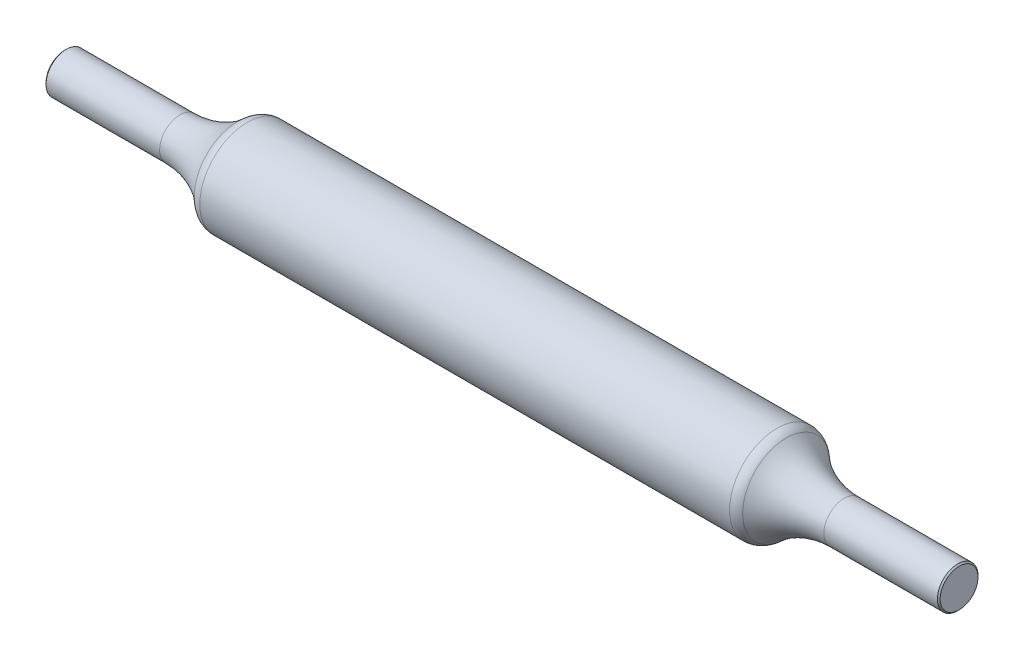
ISO-10303-21;
HEADER;
FILE_DESCRIPTION(('STEP AP214'),'2;1');
FILE_NAME('part.step','',(''),(''),'','','');
FILE_SCHEMA(('AUTOMOTIVE_DESIGN { 1 0 10303 214 1 1 1 1 }'));
ENDSEC;
DATA;
#1=APPLICATION_CONTEXT('core data for automotive mechanical design processes');
#2=APPLICATION_PROTOCOL_DEFINITION('international standard','automotive_design',2000,#1);
#3=PRODUCT_CONTEXT('',#1,'mechanical');
#4=PRODUCT('Part','Part','',(#3));
#5=PRODUCT_RELATED_PRODUCT_CATEGORY('part','',(#4));
#6=PRODUCT_DEFINITION_FORMATION('','',#4);
#7=PRODUCT_DEFINITION_CONTEXT('part definition',#1,'design');
#8=PRODUCT_DEFINITION('design','',#6,#7);
#9=PRODUCT_DEFINITION_SHAPE('','',#8);
#10=(LENGTH_UNIT() NAMED_UNIT(*) SI_UNIT(.MILLI.,.METRE.));
#11=(NAMED_UNIT(*) PLANE_ANGLE_UNIT() SI_UNIT($,.RADIAN.));
#12=(NAMED_UNIT(*) SI_UNIT($,.STERADIAN.) SOLID_ANGLE_UNIT());
#13=UNCERTAINTY_MEASURE_WITH_UNIT(LENGTH_MEASURE(1.E-05),#10,'distance_accuracy_value','');
#14=(GEOMETRIC_REPRESENTATION_CONTEXT(3) GLOBAL_UNCERTAINTY_ASSIGNED_CONTEXT((#13)) GLOBAL_UNIT_ASSIGNED_CONTEXT((#10,
#11,#12)) REPRESENTATION_CONTEXT('',''));
#15=CARTESIAN_POINT('',(0.,0.,0.));
#16=DIRECTION('',(0.,0.,1.));
#17=DIRECTION('',(1.,0.,0.));
#18=AXIS2_PLACEMENT_3D('',#15,#16,#17);
#19=CARTESIAN_POINT('',(-16.525,0.,0.));
#20=DIRECTION('',(1.,0.,0.));
#21=DIRECTION('',(0.,1.,0.));
#22=AXIS2_PLACEMENT_3D('',#19,#20,#21);
#23=PLANE('',#22);
#24=CARTESIAN_POINT('',(-16.525,0.,0.));
#25=DIRECTION('',(1.,0.,0.));
#26=DIRECTION('',(0.,1.,0.));
#27=AXIS2_PLACEMENT_3D('',#24,#25,#26);
#28=CIRCLE('',#27,0.700000000000003);
#29=CARTESIAN_POINT('',(-16.525,0.700000000000003,0.));
#30=VERTEX_POINT('',#29);
#31=EDGE_CURVE('E43',#30,#30,#28,.F.);
#32=ORIENTED_EDGE('',*,*,#31,.T.);
#33=EDGE_LOOP('',(#32));
#34=FACE_BOUND('',#33,.T.);
#35=ADVANCED_FACE('F35',(#34),#23,.F.);
#36=CARTESIAN_POINT('',(16.525,0.,0.));
#37=DIRECTION('',(-1.,0.,0.));
#38=DIRECTION('',(0.,-1.,0.));
#39=AXIS2_PLACEMENT_3D('',#36,#37,#38);
#40=PLANE('',#39);
#41=CARTESIAN_POINT('',(16.525,0.,0.));
#42=DIRECTION('',(-1.,0.,0.));
#43=DIRECTION('',(0.,-1.,0.));
#44=AXIS2_PLACEMENT_3D('',#41,#42,#43);
#45=CIRCLE('',#44,0.699999999999996);
#46=CARTESIAN_POINT('',(16.525,-0.699999999999989,0.));
#47=VERTEX_POINT('',#46);
#48=EDGE_CURVE('E47',#47,#47,#45,.F.);
#49=ORIENTED_EDGE('',*,*,#48,.T.);
#50=EDGE_LOOP('',(#49));
#51=FACE_BOUND('',#50,.T.);
#52=ADVANCED_FACE('F92',(#51),#40,.F.);
#53=CARTESIAN_POINT('',(-16.525,0.,0.));
#54=DIRECTION('',(-1.,0.,0.));
#55=DIRECTION('',(0.,-1.,0.));
#56=AXIS2_PLACEMENT_3D('',#53,#54,#55);
#57=CYLINDRICAL_SURFACE('',#56,0.75);
#58=CARTESIAN_POINT('',(16.475,0.,0.));
#59=DIRECTION('',(-1.,0.,0.));
#60=DIRECTION('',(0.,-1.,0.));
#61=AXIS2_PLACEMENT_3D('',#58,#59,#60);
#62=CIRCLE('',#61,0.75);
#63=CARTESIAN_POINT('',(16.475,-0.749999999999993,0.));
#64=VERTEX_POINT('',#63);
#65=EDGE_CURVE('E51',#64,#64,#62,.T.);
#66=ORIENTED_EDGE('',*,*,#65,.T.);
#67=EDGE_LOOP('',(#66));
#68=FACE_BOUND('',#67,.T.);
#69=CARTESIAN_POINT('',(12.275,0.,0.));
#70=DIRECTION('',(-1.,0.,0.));
#71=DIRECTION('',(0.,-1.,0.));
#72=AXIS2_PLACEMENT_3D('',#69,#70,#71);
#73=CIRCLE('',#72,0.749999999999999);
#74=CARTESIAN_POINT('',(12.275,-0.749999999999994,0.));
#75=VERTEX_POINT('',#74);
#76=EDGE_CURVE('E68',#75,#75,#73,.T.);
#77=ORIENTED_EDGE('',*,*,#76,.F.);
#78=EDGE_LOOP('',(#77));
#79=FACE_BOUND('',#78,.T.);
#80=ADVANCED_FACE('F97',(#68,#79),#57,.T.);
#81=CARTESIAN_POINT('',(12.275,0.,0.));
#82=DIRECTION('',(-1.,0.,0.));
#83=DIRECTION('',(0.,-1.,0.));
#84=AXIS2_PLACEMENT_3D('',#81,#82,#83);
#85=TOROIDAL_SURFACE('',#84,3.83781250000003,3.08781250000003);
#86=CARTESIAN_POINT('',(10.1362420313012,0.,0.));
#87=DIRECTION('',(1.,0.,0.));
#88=DIRECTION('',(0.,1.,0.));
#89=AXIS2_PLACEMENT_3D('',#86,#87,#88);
#90=CIRCLE('',#89,1.61063931713265);
#91=CARTESIAN_POINT('',(10.1362420313012,1.61063931713266,0.));
#92=VERTEX_POINT('',#91);
#93=EDGE_CURVE('E56',#92,#92,#90,.T.);
#94=ORIENTED_EDGE('',*,*,#93,.T.);
#95=EDGE_LOOP('',(#94));
#96=FACE_BOUND('',#95,.T.);
#97=ORIENTED_EDGE('',*,*,#76,.T.);
#98=EDGE_LOOP('',(#97));
#99=FACE_BOUND('',#98,.T.);
#100=ADVANCED_FACE('F88',(#96,#99),#85,.F.);
#101=CARTESIAN_POINT('',(-16.525,0.,0.));
#102=DIRECTION('',(-1.,0.,0.));
#103=DIRECTION('',(0.,-1.,0.));
#104=AXIS2_PLACEMENT_3D('',#101,#102,#103);
#105=CYLINDRICAL_SURFACE('',#104,1.75);
#106=CARTESIAN_POINT('',(-9.7899195184059,0.,0.));
#107=DIRECTION('',(1.,0.,0.));
#108=DIRECTION('',(0.,1.,0.));
#109=AXIS2_PLACEMENT_3D('',#106,#107,#108);
#110=CIRCLE('',#109,1.75);
#111=CARTESIAN_POINT('',(-9.7899195184059,1.75,0.));
#112=VERTEX_POINT('',#111);
#113=EDGE_CURVE('E59',#112,#112,#110,.T.);
#114=ORIENTED_EDGE('',*,*,#113,.T.);
#115=EDGE_LOOP('',(#114));
#116=FACE_BOUND('',#115,.T.);
#117=CARTESIAN_POINT('',(9.78991951840589,0.,0.));
#118=DIRECTION('',(1.,0.,0.));
#119=DIRECTION('',(0.,1.,0.));
#120=AXIS2_PLACEMENT_3D('',#117,#118,#119);
#121=CIRCLE('',#120,1.75);
#122=CARTESIAN_POINT('',(9.78991951840589,1.75,0.));
#123=VERTEX_POINT('',#122);
#124=EDGE_CURVE('E62',#123,#123,#121,.F.);
#125=ORIENTED_EDGE('',*,*,#124,.T.);
#126=EDGE_LOOP('',(#125));
#127=FACE_BOUND('',#126,.T.);
#128=ADVANCED_FACE('F79',(#116,#127),#105,.T.);
#129=CARTESIAN_POINT('',(-12.275,0.,0.));
#130=DIRECTION('',(-1.,0.,0.));
#131=DIRECTION('',(0.,-1.,0.));
#132=AXIS2_PLACEMENT_3D('',#129,#130,#131);
#133=TOROIDAL_SURFACE('',#132,3.83781249999999,3.08781249999999);
#134=CARTESIAN_POINT('',(-10.1362420313012,0.,0.));
#135=DIRECTION('',(-1.,0.,0.));
#136=DIRECTION('',(0.,-1.,0.));
#137=AXIS2_PLACEMENT_3D('',#134,#135,#136);
#138=CIRCLE('',#137,1.61063931713265);
#139=CARTESIAN_POINT('',(-10.1362420313012,-1.61063931713265,0.));
#140=VERTEX_POINT('',#139);
#141=EDGE_CURVE('E65',#140,#140,#138,.T.);
#142=ORIENTED_EDGE('',*,*,#141,.T.);
#143=EDGE_LOOP('',(#142));
#144=FACE_BOUND('',#143,.T.);
#145=CARTESIAN_POINT('',(-12.275,0.,0.));
#146=DIRECTION('',(-1.,0.,0.));
#147=DIRECTION('',(0.,-1.,0.));
#148=AXIS2_PLACEMENT_3D('',#145,#146,#147);
#149=CIRCLE('',#148,0.749999999999999);
#150=CARTESIAN_POINT('',(-12.275,-0.749999999999998,0.));
#151=VERTEX_POINT('',#150);
#152=EDGE_CURVE('E71',#151,#151,#149,.T.);
#153=ORIENTED_EDGE('',*,*,#152,.F.);
#154=EDGE_LOOP('',(#153));
#155=FACE_BOUND('',#154,.T.);
#156=ADVANCED_FACE('F77',(#144,#155),#133,.F.);
#157=CARTESIAN_POINT('',(-16.525,0.,0.));
#158=DIRECTION('',(-1.,0.,0.));
#159=DIRECTION('',(0.,-1.,0.));
#160=AXIS2_PLACEMENT_3D('',#157,#158,#159);
#161=CYLINDRICAL_SURFACE('',#160,0.75);
#162=CARTESIAN_POINT('',(-16.475,0.,0.));
#163=DIRECTION('',(1.,0.,0.));
#164=DIRECTION('',(0.,1.,0.));
#165=AXIS2_PLACEMENT_3D('',#162,#163,#164);
#166=CIRCLE('',#165,0.75);
#167=CARTESIAN_POINT('',(-16.475,0.75,0.));
#168=VERTEX_POINT('',#167);
#169=EDGE_CURVE('E10',#168,#168,#166,.T.);
#170=ORIENTED_EDGE('',*,*,#169,.T.);
#171=EDGE_LOOP('',(#170));
#172=FACE_BOUND('',#171,.T.);
#173=ORIENTED_EDGE('',*,*,#152,.T.);
#174=EDGE_LOOP('',(#173));
#175=FACE_BOUND('',#174,.T.);
#176=ADVANCED_FACE('F75',(#172,#175),#161,.T.);
#177=CARTESIAN_POINT('',(-9.7899195184059,0.,0.));
#178=DIRECTION('',(1.,0.,0.));
#179=DIRECTION('',(0.,1.,0.));
#180=AXIS2_PLACEMENT_3D('',#177,#178,#179);
#181=TOROIDAL_SURFACE('',#180,1.25,0.5);
#182=ORIENTED_EDGE('',*,*,#113,.F.);
#183=EDGE_LOOP('',(#182));
#184=FACE_BOUND('',#183,.T.);
#185=ORIENTED_EDGE('',*,*,#141,.F.);
#186=EDGE_LOOP('',(#185));
#187=FACE_BOUND('',#186,.T.);
#188=ADVANCED_FACE('F86',(#184,#187),#181,.T.);
#189=CARTESIAN_POINT('',(9.78991951840589,0.,0.));
#190=DIRECTION('',(1.,0.,0.));
#191=DIRECTION('',(0.,1.,0.));
#192=AXIS2_PLACEMENT_3D('',#189,#190,#191);
#193=TOROIDAL_SURFACE('',#192,1.25,0.5);
#194=ORIENTED_EDGE('',*,*,#93,.F.);
#195=EDGE_LOOP('',(#194));
#196=FACE_BOUND('',#195,.T.);
#197=ORIENTED_EDGE('',*,*,#124,.F.);
#198=EDGE_LOOP('',(#197));
#199=FACE_BOUND('',#198,.T.);
#200=ADVANCED_FACE('F104',(#196,#199),#193,.T.);
#201=CARTESIAN_POINT('',(16.475,0.,0.));
#202=DIRECTION('',(-1.,0.,0.));
#203=DIRECTION('',(0.,-1.,0.));
#204=AXIS2_PLACEMENT_3D('',#201,#202,#203);
#205=CONICAL_SURFACE('',#204,0.75,0.785398163397472);
#206=ORIENTED_EDGE('',*,*,#48,.F.);
#207=EDGE_LOOP('',(#206));
#208=FACE_BOUND('',#207,.T.);
#209=ORIENTED_EDGE('',*,*,#65,.F.);
#210=EDGE_LOOP('',(#209));
#211=FACE_BOUND('',#210,.T.);
#212=ADVANCED_FACE('F107',(#208,#211),#205,.T.);
#213=CARTESIAN_POINT('',(-16.525,0.,0.));
#214=DIRECTION('',(1.,0.,0.));
#215=DIRECTION('',(0.,1.,0.));
#216=AXIS2_PLACEMENT_3D('',#213,#214,#215);
#217=CONICAL_SURFACE('',#216,0.700000000000003,0.785398163397407);
#218=ORIENTED_EDGE('',*,*,#169,.F.);
#219=EDGE_LOOP('',(#218));
#220=FACE_BOUND('',#219,.T.);
#221=ORIENTED_EDGE('',*,*,#31,.F.);
#222=EDGE_LOOP('',(#221));
#223=FACE_BOUND('',#222,.T.);
#224=ADVANCED_FACE('F38',(#220,#223),#217,.T.);
#225=CLOSED_SHELL('',(#35,#52,#80,#100,#128,#156,#176,#188,#200,#212,#224));
#226=MANIFOLD_SOLID_BREP('B2',#225);
#227=ADVANCED_BREP_SHAPE_REPRESENTATION('',(#18,#226),#14);
#228=SHAPE_DEFINITION_REPRESENTATION(#9,#227);
ENDSEC;
END-ISO-10303-21;
